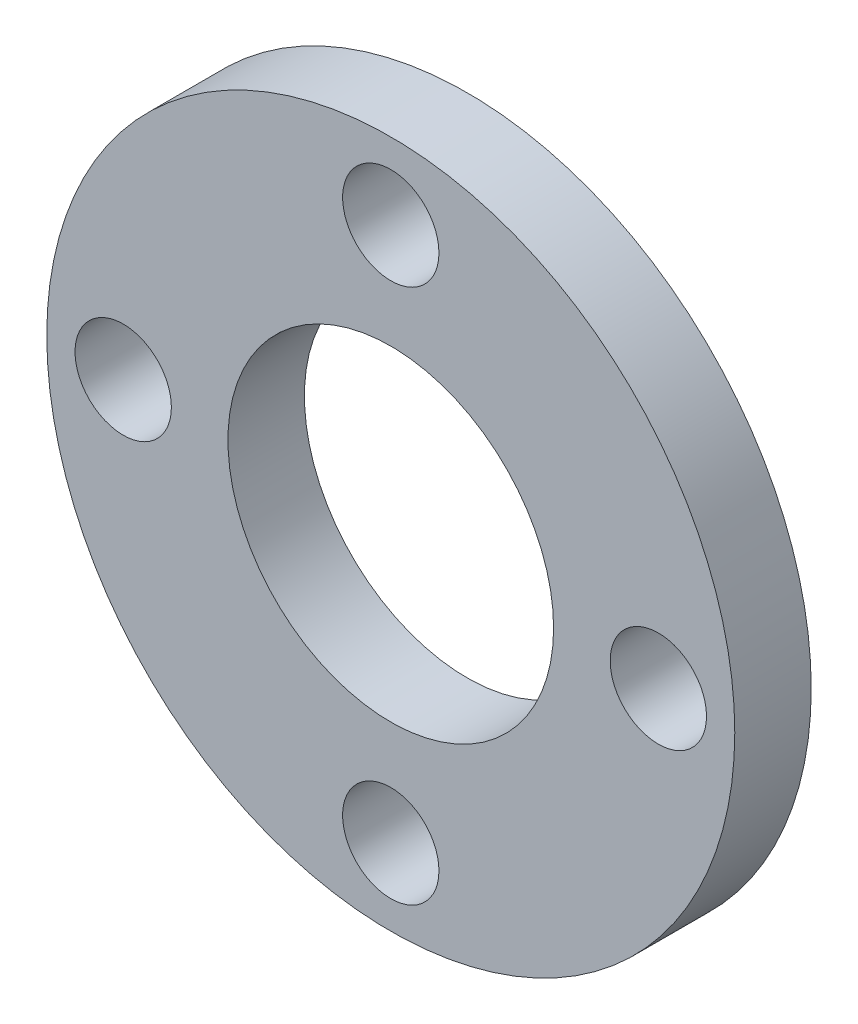
ISO-10303-21;
HEADER;
FILE_DESCRIPTION(('STEP AP214'),'2;1');
FILE_NAME('part.step','',(''),(''),'','','');
FILE_SCHEMA(('AUTOMOTIVE_DESIGN { 1 0 10303 214 1 1 1 1 }'));
ENDSEC;
DATA;
#1=APPLICATION_CONTEXT('core data for automotive mechanical design processes');
#2=APPLICATION_PROTOCOL_DEFINITION('international standard','automotive_design',2000,#1);
#3=PRODUCT_CONTEXT('',#1,'mechanical');
#4=PRODUCT('Part','Part','',(#3));
#5=PRODUCT_RELATED_PRODUCT_CATEGORY('part','',(#4));
#6=PRODUCT_DEFINITION_FORMATION('','',#4);
#7=PRODUCT_DEFINITION_CONTEXT('part definition',#1,'design');
#8=PRODUCT_DEFINITION('design','',#6,#7);
#9=PRODUCT_DEFINITION_SHAPE('','',#8);
#10=(LENGTH_UNIT() NAMED_UNIT(*) SI_UNIT(.MILLI.,.METRE.));
#11=(NAMED_UNIT(*) PLANE_ANGLE_UNIT() SI_UNIT($,.RADIAN.));
#12=(NAMED_UNIT(*) SI_UNIT($,.STERADIAN.) SOLID_ANGLE_UNIT());
#13=UNCERTAINTY_MEASURE_WITH_UNIT(LENGTH_MEASURE(1.E-05),#10,'distance_accuracy_value','');
#14=(GEOMETRIC_REPRESENTATION_CONTEXT(3) GLOBAL_UNCERTAINTY_ASSIGNED_CONTEXT((#13)) GLOBAL_UNIT_ASSIGNED_CONTEXT((#10,
#11,#12)) REPRESENTATION_CONTEXT('',''));
#15=CARTESIAN_POINT('',(0.,0.,0.));
#16=DIRECTION('',(0.,0.,1.));
#17=DIRECTION('',(1.,0.,0.));
#18=AXIS2_PLACEMENT_3D('',#15,#16,#17);
#19=CARTESIAN_POINT('',(0.,35.,10.));
#20=DIRECTION('',(0.,0.,-1.));
#21=DIRECTION('',(-1.,0.,0.));
#22=AXIS2_PLACEMENT_3D('',#19,#20,#21);
#23=CYLINDRICAL_SURFACE('',#22,6.3);
#24=CARTESIAN_POINT('',(0.,35.,10.));
#25=DIRECTION('',(0.,0.,1.));
#26=DIRECTION('',(1.,0.,0.));
#27=AXIS2_PLACEMENT_3D('',#24,#25,#26);
#28=CIRCLE('',#27,6.3);
#29=CARTESIAN_POINT('',(6.3,35.,10.));
#30=VERTEX_POINT('',#29);
#31=EDGE_CURVE('E47',#30,#30,#28,.T.);
#32=ORIENTED_EDGE('',*,*,#31,.T.);
#33=EDGE_LOOP('',(#32));
#34=FACE_BOUND('',#33,.T.);
#35=CARTESIAN_POINT('',(0.,35.,0.));
#36=DIRECTION('',(0.,0.,1.));
#37=DIRECTION('',(1.,0.,0.));
#38=AXIS2_PLACEMENT_3D('',#35,#36,#37);
#39=CIRCLE('',#38,6.3);
#40=CARTESIAN_POINT('',(6.3,35.,0.));
#41=VERTEX_POINT('',#40);
#42=EDGE_CURVE('E67',#41,#41,#39,.T.);
#43=ORIENTED_EDGE('',*,*,#42,.F.);
#44=EDGE_LOOP('',(#43));
#45=FACE_BOUND('',#44,.T.);
#46=ADVANCED_FACE('F39',(#34,#45),#23,.F.);
#47=CARTESIAN_POINT('',(35.,0.,10.));
#48=DIRECTION('',(0.,0.,-1.));
#49=DIRECTION('',(-1.,0.,0.));
#50=AXIS2_PLACEMENT_3D('',#47,#48,#49);
#51=CYLINDRICAL_SURFACE('',#50,6.3);
#52=CARTESIAN_POINT('',(35.,0.,10.));
#53=DIRECTION('',(0.,0.,1.));
#54=DIRECTION('',(1.,0.,0.));
#55=AXIS2_PLACEMENT_3D('',#52,#53,#54);
#56=CIRCLE('',#55,6.3);
#57=CARTESIAN_POINT('',(41.3,0.,10.));
#58=VERTEX_POINT('',#57);
#59=EDGE_CURVE('E52',#58,#58,#56,.T.);
#60=ORIENTED_EDGE('',*,*,#59,.T.);
#61=EDGE_LOOP('',(#60));
#62=FACE_BOUND('',#61,.T.);
#63=CARTESIAN_POINT('',(35.,0.,0.));
#64=DIRECTION('',(0.,0.,1.));
#65=DIRECTION('',(1.,0.,0.));
#66=AXIS2_PLACEMENT_3D('',#63,#64,#65);
#67=CIRCLE('',#66,6.3);
#68=CARTESIAN_POINT('',(41.3,0.,0.));
#69=VERTEX_POINT('',#68);
#70=EDGE_CURVE('E65',#69,#69,#67,.T.);
#71=ORIENTED_EDGE('',*,*,#70,.F.);
#72=EDGE_LOOP('',(#71));
#73=FACE_BOUND('',#72,.T.);
#74=ADVANCED_FACE('F88',(#62,#73),#51,.F.);
#75=CARTESIAN_POINT('',(0.,-35.,10.));
#76=DIRECTION('',(0.,0.,-1.));
#77=DIRECTION('',(-1.,0.,0.));
#78=AXIS2_PLACEMENT_3D('',#75,#76,#77);
#79=CYLINDRICAL_SURFACE('',#78,6.3);
#80=CARTESIAN_POINT('',(0.,-35.,10.));
#81=DIRECTION('',(0.,0.,1.));
#82=DIRECTION('',(1.,0.,0.));
#83=AXIS2_PLACEMENT_3D('',#80,#81,#82);
#84=CIRCLE('',#83,6.3);
#85=CARTESIAN_POINT('',(6.3,-35.,10.));
#86=VERTEX_POINT('',#85);
#87=EDGE_CURVE('E81',#86,#86,#84,.T.);
#88=ORIENTED_EDGE('',*,*,#87,.T.);
#89=EDGE_LOOP('',(#88));
#90=FACE_BOUND('',#89,.T.);
#91=CARTESIAN_POINT('',(0.,-35.,0.));
#92=DIRECTION('',(0.,0.,1.));
#93=DIRECTION('',(1.,0.,0.));
#94=AXIS2_PLACEMENT_3D('',#91,#92,#93);
#95=CIRCLE('',#94,6.3);
#96=CARTESIAN_POINT('',(6.3,-35.,0.));
#97=VERTEX_POINT('',#96);
#98=EDGE_CURVE('E62',#97,#97,#95,.T.);
#99=ORIENTED_EDGE('',*,*,#98,.F.);
#100=EDGE_LOOP('',(#99));
#101=FACE_BOUND('',#100,.T.);
#102=ADVANCED_FACE('F106',(#90,#101),#79,.F.);
#103=CARTESIAN_POINT('',(-35.,0.,10.));
#104=DIRECTION('',(0.,0.,-1.));
#105=DIRECTION('',(-1.,0.,0.));
#106=AXIS2_PLACEMENT_3D('',#103,#104,#105);
#107=CYLINDRICAL_SURFACE('',#106,6.3);
#108=CARTESIAN_POINT('',(-35.,0.,10.));
#109=DIRECTION('',(0.,0.,1.));
#110=DIRECTION('',(1.,0.,0.));
#111=AXIS2_PLACEMENT_3D('',#108,#109,#110);
#112=CIRCLE('',#111,6.3);
#113=CARTESIAN_POINT('',(-28.7,0.,10.));
#114=VERTEX_POINT('',#113);
#115=EDGE_CURVE('E76',#114,#114,#112,.T.);
#116=ORIENTED_EDGE('',*,*,#115,.T.);
#117=EDGE_LOOP('',(#116));
#118=FACE_BOUND('',#117,.T.);
#119=CARTESIAN_POINT('',(-35.,0.,0.));
#120=DIRECTION('',(0.,0.,1.));
#121=DIRECTION('',(1.,0.,0.));
#122=AXIS2_PLACEMENT_3D('',#119,#120,#121);
#123=CIRCLE('',#122,6.3);
#124=CARTESIAN_POINT('',(-28.7,0.,0.));
#125=VERTEX_POINT('',#124);
#126=EDGE_CURVE('E59',#125,#125,#123,.T.);
#127=ORIENTED_EDGE('',*,*,#126,.F.);
#128=EDGE_LOOP('',(#127));
#129=FACE_BOUND('',#128,.T.);
#130=ADVANCED_FACE('F112',(#118,#129),#107,.F.);
#131=CARTESIAN_POINT('',(0.,0.,10.));
#132=DIRECTION('',(0.,0.,-1.));
#133=DIRECTION('',(-1.,0.,0.));
#134=AXIS2_PLACEMENT_3D('',#131,#132,#133);
#135=CYLINDRICAL_SURFACE('',#134,21.3);
#136=CARTESIAN_POINT('',(0.,0.,10.));
#137=DIRECTION('',(0.,0.,1.));
#138=DIRECTION('',(1.,0.,0.));
#139=AXIS2_PLACEMENT_3D('',#136,#137,#138);
#140=CIRCLE('',#139,21.3);
#141=CARTESIAN_POINT('',(21.3,0.,10.));
#142=VERTEX_POINT('',#141);
#143=EDGE_CURVE('E72',#142,#142,#140,.T.);
#144=ORIENTED_EDGE('',*,*,#143,.T.);
#145=EDGE_LOOP('',(#144));
#146=FACE_BOUND('',#145,.T.);
#147=CARTESIAN_POINT('',(0.,0.,0.));
#148=DIRECTION('',(0.,0.,1.));
#149=DIRECTION('',(1.,0.,0.));
#150=AXIS2_PLACEMENT_3D('',#147,#148,#149);
#151=CIRCLE('',#150,21.3);
#152=CARTESIAN_POINT('',(21.3,0.,0.));
#153=VERTEX_POINT('',#152);
#154=EDGE_CURVE('E56',#153,#153,#151,.T.);
#155=ORIENTED_EDGE('',*,*,#154,.F.);
#156=EDGE_LOOP('',(#155));
#157=FACE_BOUND('',#156,.T.);
#158=ADVANCED_FACE('F41',(#146,#157),#135,.F.);
#159=CARTESIAN_POINT('',(0.,0.,10.));
#160=DIRECTION('',(0.,0.,-1.));
#161=DIRECTION('',(-1.,0.,0.));
#162=AXIS2_PLACEMENT_3D('',#159,#160,#161);
#163=CYLINDRICAL_SURFACE('',#162,45.);
#164=CARTESIAN_POINT('',(0.,0.,10.));
#165=DIRECTION('',(0.,0.,1.));
#166=DIRECTION('',(1.,0.,0.));
#167=AXIS2_PLACEMENT_3D('',#164,#165,#166);
#168=CIRCLE('',#167,45.);
#169=CARTESIAN_POINT('',(45.,0.,10.));
#170=VERTEX_POINT('',#169);
#171=EDGE_CURVE('E10',#170,#170,#168,.T.);
#172=ORIENTED_EDGE('',*,*,#171,.F.);
#173=EDGE_LOOP('',(#172));
#174=FACE_BOUND('',#173,.T.);
#175=CARTESIAN_POINT('',(0.,0.,0.));
#176=DIRECTION('',(0.,0.,1.));
#177=DIRECTION('',(1.,0.,0.));
#178=AXIS2_PLACEMENT_3D('',#175,#176,#177);
#179=CIRCLE('',#178,45.);
#180=CARTESIAN_POINT('',(45.,0.,0.));
#181=VERTEX_POINT('',#180);
#182=EDGE_CURVE('E43',#181,#181,#179,.T.);
#183=ORIENTED_EDGE('',*,*,#182,.T.);
#184=EDGE_LOOP('',(#183));
#185=FACE_BOUND('',#184,.T.);
#186=ADVANCED_FACE('F95',(#174,#185),#163,.T.);
#187=CARTESIAN_POINT('',(0.,0.,10.));
#188=DIRECTION('',(0.,0.,1.));
#189=DIRECTION('',(1.,0.,0.));
#190=AXIS2_PLACEMENT_3D('',#187,#188,#189);
#191=PLANE('',#190);
#192=ORIENTED_EDGE('',*,*,#143,.F.);
#193=EDGE_LOOP('',(#192));
#194=FACE_BOUND('',#193,.T.);
#195=ORIENTED_EDGE('',*,*,#115,.F.);
#196=EDGE_LOOP('',(#195));
#197=FACE_BOUND('',#196,.T.);
#198=ORIENTED_EDGE('',*,*,#87,.F.);
#199=EDGE_LOOP('',(#198));
#200=FACE_BOUND('',#199,.T.);
#201=ORIENTED_EDGE('',*,*,#59,.F.);
#202=EDGE_LOOP('',(#201));
#203=FACE_BOUND('',#202,.T.);
#204=ORIENTED_EDGE('',*,*,#31,.F.);
#205=EDGE_LOOP('',(#204));
#206=FACE_BOUND('',#205,.T.);
#207=ORIENTED_EDGE('',*,*,#171,.T.);
#208=EDGE_LOOP('',(#207));
#209=FACE_BOUND('',#208,.T.);
#210=ADVANCED_FACE('F91',(#194,#197,#200,#203,#206,#209),#191,.T.);
#211=CARTESIAN_POINT('',(0.,0.,0.));
#212=DIRECTION('',(0.,0.,1.));
#213=DIRECTION('',(1.,0.,0.));
#214=AXIS2_PLACEMENT_3D('',#211,#212,#213);
#215=PLANE('',#214);
#216=ORIENTED_EDGE('',*,*,#154,.T.);
#217=EDGE_LOOP('',(#216));
#218=FACE_BOUND('',#217,.T.);
#219=ORIENTED_EDGE('',*,*,#126,.T.);
#220=EDGE_LOOP('',(#219));
#221=FACE_BOUND('',#220,.T.);
#222=ORIENTED_EDGE('',*,*,#98,.T.);
#223=EDGE_LOOP('',(#222));
#224=FACE_BOUND('',#223,.T.);
#225=ORIENTED_EDGE('',*,*,#70,.T.);
#226=EDGE_LOOP('',(#225));
#227=FACE_BOUND('',#226,.T.);
#228=ORIENTED_EDGE('',*,*,#42,.T.);
#229=EDGE_LOOP('',(#228));
#230=FACE_BOUND('',#229,.T.);
#231=ORIENTED_EDGE('',*,*,#182,.F.);
#232=EDGE_LOOP('',(#231));
#233=FACE_BOUND('',#232,.T.);
#234=ADVANCED_FACE('F94',(#218,#221,#224,#227,#230,#233),#215,.F.);
#235=CLOSED_SHELL('',(#46,#74,#102,#130,#158,#186,#210,#234));
#236=MANIFOLD_SOLID_BREP('B2',#235);
#237=ADVANCED_BREP_SHAPE_REPRESENTATION('',(#18,#236),#14);
#238=SHAPE_DEFINITION_REPRESENTATION(#9,#237);
ENDSEC;
END-ISO-10303-21;
